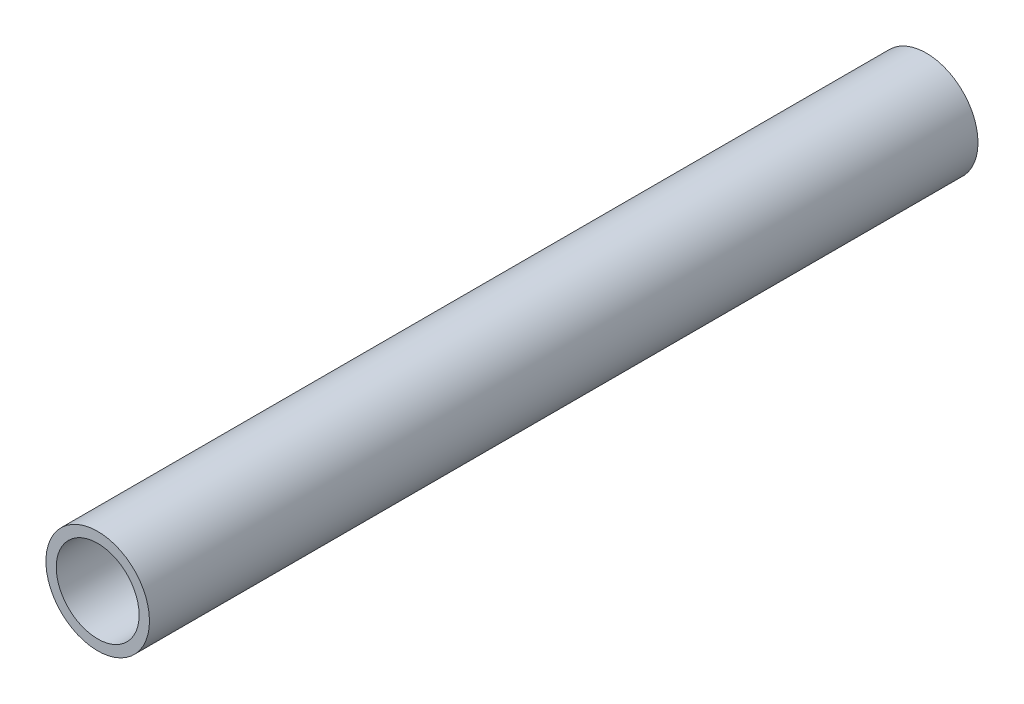
ISO-10303-21;
HEADER;
FILE_DESCRIPTION(('STEP AP214'),'2;1');
FILE_NAME('part.step','',(''),(''),'','','');
FILE_SCHEMA(('AUTOMOTIVE_DESIGN { 1 0 10303 214 1 1 1 1 }'));
ENDSEC;
DATA;
#1=APPLICATION_CONTEXT('core data for automotive mechanical design processes');
#2=APPLICATION_PROTOCOL_DEFINITION('international standard','automotive_design',2000,#1);
#3=PRODUCT_CONTEXT('',#1,'mechanical');
#4=PRODUCT('Part','Part','',(#3));
#5=PRODUCT_RELATED_PRODUCT_CATEGORY('part','',(#4));
#6=PRODUCT_DEFINITION_FORMATION('','',#4);
#7=PRODUCT_DEFINITION_CONTEXT('part definition',#1,'design');
#8=PRODUCT_DEFINITION('design','',#6,#7);
#9=PRODUCT_DEFINITION_SHAPE('','',#8);
#10=(LENGTH_UNIT() NAMED_UNIT(*) SI_UNIT(.MILLI.,.METRE.));
#11=(NAMED_UNIT(*) PLANE_ANGLE_UNIT() SI_UNIT($,.RADIAN.));
#12=(NAMED_UNIT(*) SI_UNIT($,.STERADIAN.) SOLID_ANGLE_UNIT());
#13=UNCERTAINTY_MEASURE_WITH_UNIT(LENGTH_MEASURE(1.E-05),#10,'distance_accuracy_value','');
#14=(GEOMETRIC_REPRESENTATION_CONTEXT(3) GLOBAL_UNCERTAINTY_ASSIGNED_CONTEXT((#13)) GLOBAL_UNIT_ASSIGNED_CONTEXT((#10,
#11,#12)) REPRESENTATION_CONTEXT('',''));
#15=CARTESIAN_POINT('',(0.,0.,0.));
#16=DIRECTION('',(0.,0.,1.));
#17=DIRECTION('',(1.,0.,0.));
#18=AXIS2_PLACEMENT_3D('',#15,#16,#17);
#19=CARTESIAN_POINT('',(0.,0.,80.));
#20=DIRECTION('',(0.,0.,1.));
#21=DIRECTION('',(1.,0.,0.));
#22=AXIS2_PLACEMENT_3D('',#19,#20,#21);
#23=PLANE('',#22);
#24=CARTESIAN_POINT('',(0.,0.,80.));
#25=DIRECTION('',(0.,0.,1.));
#26=DIRECTION('',(1.,0.,0.));
#27=AXIS2_PLACEMENT_3D('',#24,#25,#26);
#28=CIRCLE('',#27,5.);
#29=CARTESIAN_POINT('',(5.,0.,80.));
#30=VERTEX_POINT('',#29);
#31=EDGE_CURVE('E10',#30,#30,#28,.T.);
#32=ORIENTED_EDGE('',*,*,#31,.T.);
#33=EDGE_LOOP('',(#32));
#34=FACE_BOUND('',#33,.T.);
#35=CARTESIAN_POINT('',(0.,0.,80.));
#36=DIRECTION('',(0.,0.,1.));
#37=DIRECTION('',(1.,0.,0.));
#38=AXIS2_PLACEMENT_3D('',#35,#36,#37);
#39=CIRCLE('',#38,4.);
#40=CARTESIAN_POINT('',(4.,0.,80.));
#41=VERTEX_POINT('',#40);
#42=EDGE_CURVE('E47',#41,#41,#39,.T.);
#43=ORIENTED_EDGE('',*,*,#42,.F.);
#44=EDGE_LOOP('',(#43));
#45=FACE_BOUND('',#44,.T.);
#46=ADVANCED_FACE('F36',(#34,#45),#23,.T.);
#47=CARTESIAN_POINT('',(0.,0.,0.));
#48=DIRECTION('',(0.,0.,1.));
#49=DIRECTION('',(1.,0.,0.));
#50=AXIS2_PLACEMENT_3D('',#47,#48,#49);
#51=PLANE('',#50);
#52=CARTESIAN_POINT('',(0.,0.,0.));
#53=DIRECTION('',(0.,0.,1.));
#54=DIRECTION('',(1.,0.,0.));
#55=AXIS2_PLACEMENT_3D('',#52,#53,#54);
#56=CIRCLE('',#55,5.);
#57=CARTESIAN_POINT('',(5.,0.,0.));
#58=VERTEX_POINT('',#57);
#59=EDGE_CURVE('E40',#58,#58,#56,.T.);
#60=ORIENTED_EDGE('',*,*,#59,.F.);
#61=EDGE_LOOP('',(#60));
#62=FACE_BOUND('',#61,.T.);
#63=CARTESIAN_POINT('',(0.,0.,0.));
#64=DIRECTION('',(0.,0.,1.));
#65=DIRECTION('',(1.,0.,0.));
#66=AXIS2_PLACEMENT_3D('',#63,#64,#65);
#67=CIRCLE('',#66,4.);
#68=CARTESIAN_POINT('',(4.,0.,0.));
#69=VERTEX_POINT('',#68);
#70=EDGE_CURVE('E49',#69,#69,#67,.T.);
#71=ORIENTED_EDGE('',*,*,#70,.T.);
#72=EDGE_LOOP('',(#71));
#73=FACE_BOUND('',#72,.T.);
#74=ADVANCED_FACE('F59',(#62,#73),#51,.F.);
#75=CARTESIAN_POINT('',(0.,0.,80.));
#76=DIRECTION('',(0.,0.,-1.));
#77=DIRECTION('',(-1.,0.,0.));
#78=AXIS2_PLACEMENT_3D('',#75,#76,#77);
#79=CYLINDRICAL_SURFACE('',#78,5.);
#80=ORIENTED_EDGE('',*,*,#31,.F.);
#81=EDGE_LOOP('',(#80));
#82=FACE_BOUND('',#81,.T.);
#83=ORIENTED_EDGE('',*,*,#59,.T.);
#84=EDGE_LOOP('',(#83));
#85=FACE_BOUND('',#84,.T.);
#86=ADVANCED_FACE('F38',(#82,#85),#79,.T.);
#87=CARTESIAN_POINT('',(0.,0.,80.));
#88=DIRECTION('',(0.,0.,-1.));
#89=DIRECTION('',(-1.,0.,0.));
#90=AXIS2_PLACEMENT_3D('',#87,#88,#89);
#91=CYLINDRICAL_SURFACE('',#90,4.);
#92=ORIENTED_EDGE('',*,*,#42,.T.);
#93=EDGE_LOOP('',(#92));
#94=FACE_BOUND('',#93,.T.);
#95=ORIENTED_EDGE('',*,*,#70,.F.);
#96=EDGE_LOOP('',(#95));
#97=FACE_BOUND('',#96,.T.);
#98=ADVANCED_FACE('F55',(#94,#97),#91,.F.);
#99=CLOSED_SHELL('',(#46,#74,#86,#98));
#100=MANIFOLD_SOLID_BREP('B2',#99);
#101=ADVANCED_BREP_SHAPE_REPRESENTATION('',(#18,#100),#14);
#102=SHAPE_DEFINITION_REPRESENTATION(#9,#101);
ENDSEC;
END-ISO-10303-21;
